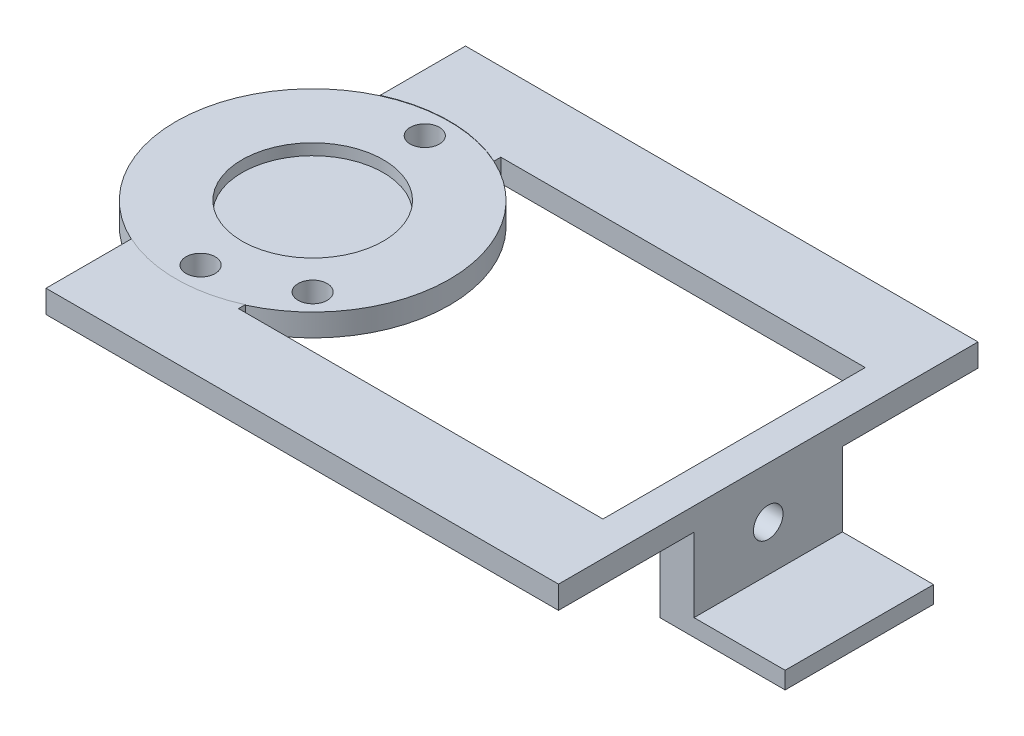
ISO-10303-21;
HEADER;
FILE_DESCRIPTION(('STEP AP214'),'2;1');
FILE_NAME('part.step','',(''),(''),'','','');
FILE_SCHEMA(('AUTOMOTIVE_DESIGN { 1 0 10303 214 1 1 1 1 }'));
ENDSEC;
DATA;
#1=APPLICATION_CONTEXT('core data for automotive mechanical design processes');
#2=APPLICATION_PROTOCOL_DEFINITION('international standard','automotive_design',2000,#1);
#3=PRODUCT_CONTEXT('',#1,'mechanical');
#4=PRODUCT('Part','Part','',(#3));
#5=PRODUCT_RELATED_PRODUCT_CATEGORY('part','',(#4));
#6=PRODUCT_DEFINITION_FORMATION('','',#4);
#7=PRODUCT_DEFINITION_CONTEXT('part definition',#1,'design');
#8=PRODUCT_DEFINITION('design','',#6,#7);
#9=PRODUCT_DEFINITION_SHAPE('','',#8);
#10=(LENGTH_UNIT() NAMED_UNIT(*) SI_UNIT(.MILLI.,.METRE.));
#11=(NAMED_UNIT(*) PLANE_ANGLE_UNIT() SI_UNIT($,.RADIAN.));
#12=(NAMED_UNIT(*) SI_UNIT($,.STERADIAN.) SOLID_ANGLE_UNIT());
#13=UNCERTAINTY_MEASURE_WITH_UNIT(LENGTH_MEASURE(1.E-05),#10,'distance_accuracy_value','');
#14=(GEOMETRIC_REPRESENTATION_CONTEXT(3) GLOBAL_UNCERTAINTY_ASSIGNED_CONTEXT((#13)) GLOBAL_UNIT_ASSIGNED_CONTEXT((#10,
#11,#12)) REPRESENTATION_CONTEXT('',''));
#15=CARTESIAN_POINT('',(0.,0.,0.));
#16=DIRECTION('',(0.,0.,1.));
#17=DIRECTION('',(1.,0.,0.));
#18=AXIS2_PLACEMENT_3D('',#15,#16,#17);
#19=CARTESIAN_POINT('',(101.6,-6.35,0.));
#20=DIRECTION('',(-1.,0.,0.));
#21=DIRECTION('',(0.,0.,1.));
#22=AXIS2_PLACEMENT_3D('',#19,#20,#21);
#23=CYLINDRICAL_SURFACE('',#22,3.302);
#24=CARTESIAN_POINT('',(101.6,-6.35,0.));
#25=DIRECTION('',(-1.,0.,0.));
#26=DIRECTION('',(0.,0.,1.));
#27=AXIS2_PLACEMENT_3D('',#24,#25,#26);
#28=CIRCLE('',#27,3.302);
#29=CARTESIAN_POINT('',(101.6,-6.35,3.30200000000001));
#30=VERTEX_POINT('',#29);
#31=EDGE_CURVE('E485',#30,#30,#28,.T.);
#32=CARTESIAN_POINT('',(96.52,-6.35,0.));
#33=DIRECTION('',(-1.,0.,0.));
#34=DIRECTION('',(0.,0.,1.));
#35=AXIS2_PLACEMENT_3D('',#32,#33,#34);
#36=CIRCLE('',#35,3.302);
#37=CARTESIAN_POINT('',(96.52,-6.35,3.30200000000001));
#38=VERTEX_POINT('',#37);
#39=EDGE_CURVE('E48',#38,#38,#36,.F.);
#40=CARTESIAN_POINT('',(101.6,-6.35,3.30200000000001));
#41=CARTESIAN_POINT('',(101.547083333333,-6.35,3.30200000000001));
#42=CARTESIAN_POINT('',(101.494166666667,-6.35,3.30200000000001));
#43=CARTESIAN_POINT('',(101.388333333333,-6.35,3.30200000000001));
#44=CARTESIAN_POINT('',(101.335416666667,-6.35,3.30200000000001));
#45=CARTESIAN_POINT('',(101.229583333333,-6.35,3.30200000000001));
#46=CARTESIAN_POINT('',(101.176666666667,-6.35,3.30200000000001));
#47=CARTESIAN_POINT('',(101.070833333333,-6.35,3.30200000000001));
#48=CARTESIAN_POINT('',(101.017916666667,-6.35,3.30200000000001));
#49=CARTESIAN_POINT('',(100.912083333333,-6.35,3.30200000000001));
#50=CARTESIAN_POINT('',(100.859166666667,-6.35,3.30200000000001));
#51=CARTESIAN_POINT('',(100.753333333333,-6.35,3.30200000000001));
#52=CARTESIAN_POINT('',(100.700416666667,-6.35,3.30200000000001));
#53=CARTESIAN_POINT('',(100.594583333333,-6.35,3.30200000000001));
#54=CARTESIAN_POINT('',(100.541666666667,-6.35,3.30200000000001));
#55=CARTESIAN_POINT('',(100.435833333333,-6.35,3.30200000000001));
#56=CARTESIAN_POINT('',(100.382916666667,-6.35,3.30200000000001));
#57=CARTESIAN_POINT('',(100.277083333333,-6.35,3.30200000000001));
#58=CARTESIAN_POINT('',(100.224166666667,-6.35,3.30200000000001));
#59=CARTESIAN_POINT('',(100.118333333333,-6.35,3.30200000000001));
#60=CARTESIAN_POINT('',(100.065416666667,-6.35,3.30200000000001));
#61=CARTESIAN_POINT('',(99.9595833333333,-6.35,3.30200000000001));
#62=CARTESIAN_POINT('',(99.9066666666667,-6.35,3.30200000000001));
#63=CARTESIAN_POINT('',(99.8008333333333,-6.35,3.30200000000001));
#64=CARTESIAN_POINT('',(99.7479166666667,-6.35,3.30200000000001));
#65=CARTESIAN_POINT('',(99.6420833333333,-6.35,3.30200000000001));
#66=CARTESIAN_POINT('',(99.5891666666667,-6.35,3.30200000000001));
#67=CARTESIAN_POINT('',(99.4833333333333,-6.35,3.30200000000001));
#68=CARTESIAN_POINT('',(99.4304166666667,-6.35,3.30200000000001));
#69=CARTESIAN_POINT('',(99.3245833333333,-6.35,3.30200000000001));
#70=CARTESIAN_POINT('',(99.2716666666667,-6.35,3.30200000000001));
#71=CARTESIAN_POINT('',(99.1658333333333,-6.35,3.30200000000001));
#72=CARTESIAN_POINT('',(99.1129166666667,-6.35,3.30200000000001));
#73=CARTESIAN_POINT('',(99.0070833333333,-6.35,3.30200000000001));
#74=CARTESIAN_POINT('',(98.9541666666667,-6.35,3.30200000000001));
#75=CARTESIAN_POINT('',(98.8483333333333,-6.35,3.30200000000001));
#76=CARTESIAN_POINT('',(98.7954166666667,-6.35,3.30200000000001));
#77=CARTESIAN_POINT('',(98.6895833333333,-6.35,3.30200000000001));
#78=CARTESIAN_POINT('',(98.6366666666667,-6.35,3.30200000000001));
#79=CARTESIAN_POINT('',(98.5308333333333,-6.35,3.30200000000001));
#80=CARTESIAN_POINT('',(98.4779166666667,-6.35,3.30200000000001));
#81=CARTESIAN_POINT('',(98.3720833333333,-6.35,3.30200000000001));
#82=CARTESIAN_POINT('',(98.3191666666666,-6.35,3.30200000000001));
#83=CARTESIAN_POINT('',(98.2133333333333,-6.35,3.30200000000001));
#84=CARTESIAN_POINT('',(98.1604166666666,-6.35,3.30200000000001));
#85=CARTESIAN_POINT('',(98.0545833333333,-6.35,3.30200000000001));
#86=CARTESIAN_POINT('',(98.0016666666667,-6.35,3.30200000000001));
#87=CARTESIAN_POINT('',(97.8958333333333,-6.35,3.30200000000001));
#88=CARTESIAN_POINT('',(97.8429166666667,-6.35,3.30200000000001));
#89=CARTESIAN_POINT('',(97.7370833333333,-6.35,3.30200000000001));
#90=CARTESIAN_POINT('',(97.6841666666667,-6.35,3.30200000000001));
#91=CARTESIAN_POINT('',(97.5783333333333,-6.35,3.30200000000001));
#92=CARTESIAN_POINT('',(97.5254166666667,-6.35,3.30200000000001));
#93=CARTESIAN_POINT('',(97.4195833333333,-6.35,3.30200000000001));
#94=CARTESIAN_POINT('',(97.3666666666667,-6.35,3.30200000000001));
#95=CARTESIAN_POINT('',(97.2608333333333,-6.35,3.30200000000001));
#96=CARTESIAN_POINT('',(97.2079166666667,-6.35,3.30200000000001));
#97=CARTESIAN_POINT('',(97.1020833333333,-6.35,3.30200000000001));
#98=CARTESIAN_POINT('',(97.0491666666667,-6.35,3.30200000000001));
#99=CARTESIAN_POINT('',(96.9433333333333,-6.35,3.30200000000001));
#100=CARTESIAN_POINT('',(96.8904166666667,-6.35,3.30200000000001));
#101=CARTESIAN_POINT('',(96.7845833333333,-6.35,3.30200000000001));
#102=CARTESIAN_POINT('',(96.7316666666667,-6.35,3.30200000000001));
#103=CARTESIAN_POINT('',(96.6258333333333,-6.35,3.30200000000001));
#104=CARTESIAN_POINT('',(96.5729166666666,-6.35,3.30200000000001));
#105=CARTESIAN_POINT('',(96.52,-6.35,3.30200000000001));
#106=B_SPLINE_CURVE_WITH_KNOTS('',3,(#40,#41,#42,#43,#44,#45,#46,#47,#48,#49,#50,#51,#52,#53,
#54,#55,#56,#57,#58,#59,#60,#61,#62,#63,#64,#65,#66,#67,#68,#69,#70,#71,#72,#73,#74,#75,#76,#77,
#78,#79,#80,#81,#82,#83,#84,#85,#86,#87,#88,#89,#90,#91,#92,#93,#94,#95,#96,#97,#98,#99,#100,
#101,#102,#103,#104,#105),.UNSPECIFIED.,.F.,.F.,(4,2,2,2,2,2,2,2,2,2,2,2,2,2,2,2,2,2,2,2,2,2,2,
2,2,2,2,2,2,2,2,2,4),(0.,0.158750000000013,0.317500000000012,0.476250000000011,
0.635000000000011,0.79375000000001,0.952500000000009,1.11125000000001,1.27000000000001,
1.42875000000001,1.58750000000001,1.74625000000002,1.90500000000002,2.06375000000002,
2.22250000000002,2.38125000000002,2.54000000000001,2.69875000000001,2.85750000000001,
3.01625000000001,3.17500000000001,3.33375000000002,3.49250000000002,3.65125000000002,
3.81000000000002,3.96875000000002,4.12750000000002,4.28625000000002,4.44500000000002,
4.60375000000002,4.76250000000002,4.92125000000002,5.08000000000003),.UNSPECIFIED.);
#107=EDGE_CURVE('BSEAM44',#30,#38,#106,.T.);
#108=ORIENTED_EDGE('',*,*,#31,.F.);
#109=ORIENTED_EDGE('',*,*,#39,.F.);
#110=ORIENTED_EDGE('',*,*,#107,.T.);
#111=ORIENTED_EDGE('',*,*,#107,.F.);
#112=EDGE_LOOP('',(#108,#110,#109,#111));
#113=FACE_BOUND('',#112,.T.);
#114=ADVANCED_FACE('F44',(#113),#23,.F.);
#115=CARTESIAN_POINT('',(0.,0.,0.));
#116=DIRECTION('',(0.,1.,0.));
#117=DIRECTION('',(0.,0.,1.));
#118=AXIS2_PLACEMENT_3D('',#115,#116,#117);
#119=PLANE('',#118);
#120=CARTESIAN_POINT('',(0.,0.,0.));
#121=DIRECTION('',(0.,-1.,0.));
#122=DIRECTION('',(0.,0.,-1.));
#123=AXIS2_PLACEMENT_3D('',#120,#121,#122);
#124=CIRCLE('',#123,15.75);
#125=CARTESIAN_POINT('',(0.,0.,-15.75));
#126=VERTEX_POINT('',#125);
#127=EDGE_CURVE('E12',#126,#126,#124,.T.);
#128=ORIENTED_EDGE('',*,*,#127,.F.);
#129=EDGE_LOOP('',(#128));
#130=FACE_BOUND('',#129,.T.);
#131=CARTESIAN_POINT('',(0.,0.,-25.));
#132=DIRECTION('',(0.,-1.,0.));
#133=DIRECTION('',(0.,0.,-1.));
#134=AXIS2_PLACEMENT_3D('',#131,#132,#133);
#135=CIRCLE('',#134,3.25);
#136=CARTESIAN_POINT('',(0.,0.,-28.25));
#137=VERTEX_POINT('',#136);
#138=EDGE_CURVE('E337',#137,#137,#135,.T.);
#139=ORIENTED_EDGE('',*,*,#138,.F.);
#140=EDGE_LOOP('',(#139));
#141=FACE_BOUND('',#140,.T.);
#142=CARTESIAN_POINT('',(0.,0.,25.));
#143=DIRECTION('',(0.,-1.,0.));
#144=DIRECTION('',(0.,0.,-1.));
#145=AXIS2_PLACEMENT_3D('',#142,#143,#144);
#146=CIRCLE('',#145,3.25);
#147=CARTESIAN_POINT('',(0.,0.,21.75));
#148=VERTEX_POINT('',#147);
#149=EDGE_CURVE('E331',#148,#148,#146,.T.);
#150=ORIENTED_EDGE('',*,*,#149,.F.);
#151=EDGE_LOOP('',(#150));
#152=FACE_BOUND('',#151,.T.);
#153=CARTESIAN_POINT('',(17.6744764826842,0.,17.680862));
#154=DIRECTION('',(0.,-1.,0.));
#155=DIRECTION('',(0.,0.,-1.));
#156=AXIS2_PLACEMENT_3D('',#153,#154,#155);
#157=CIRCLE('',#156,3.25);
#158=CARTESIAN_POINT('',(17.6744764826842,0.,14.430862));
#159=VERTEX_POINT('',#158);
#160=EDGE_CURVE('E325',#159,#159,#157,.T.);
#161=ORIENTED_EDGE('',*,*,#160,.F.);
#162=EDGE_LOOP('',(#161));
#163=FACE_BOUND('',#162,.T.);
#164=DIRECTION('',(1.,0.,0.));
#165=VECTOR('',#164,1.);
#166=CARTESIAN_POINT('',(93.98,0.,-16.5541280198992));
#167=LINE('',#166,#165);
#168=CARTESIAN_POINT('',(93.98,0.,-16.5541280198992));
#169=VERTEX_POINT('',#168);
#170=CARTESIAN_POINT('',(101.6,0.,-16.5541280198992));
#171=VERTEX_POINT('',#170);
#172=EDGE_CURVE('E202',#169,#171,#167,.T.);
#173=ORIENTED_EDGE('',*,*,#172,.F.);
#174=DIRECTION('',(0.,0.,1.));
#175=VECTOR('',#174,1.);
#176=CARTESIAN_POINT('',(93.98,0.,-34.2458719801008));
#177=LINE('',#176,#175);
#178=CARTESIAN_POINT('',(93.98,0.,-29.2541280198992));
#179=VERTEX_POINT('',#178);
#180=EDGE_CURVE('E241',#179,#169,#177,.T.);
#181=ORIENTED_EDGE('',*,*,#180,.F.);
#182=DIRECTION('',(-1.,0.,0.));
#183=VECTOR('',#182,1.);
#184=CARTESIAN_POINT('',(119.38,0.,-29.2541280198992));
#185=LINE('',#184,#183);
#186=CARTESIAN_POINT('',(12.7,0.,-29.2541280198992));
#187=VERTEX_POINT('',#186);
#188=EDGE_CURVE('E257',#179,#187,#185,.T.);
#189=ORIENTED_EDGE('',*,*,#188,.T.);
#190=DIRECTION('',(0.,0.,-1.));
#191=VECTOR('',#190,1.);
#192=CARTESIAN_POINT('',(12.7,0.,0.));
#193=LINE('',#192,#191);
#194=CARTESIAN_POINT('',(12.7,0.,-27.7301280198992));
#195=VERTEX_POINT('',#194);
#196=EDGE_CURVE('E261',#195,#187,#193,.T.);
#197=ORIENTED_EDGE('',*,*,#196,.F.);
#198=CARTESIAN_POINT('',(0.,0.,0.));
#199=DIRECTION('',(0.,1.,0.));
#200=DIRECTION('',(0.,0.,1.));
#201=AXIS2_PLACEMENT_3D('',#198,#199,#200);
#202=CIRCLE('',#201,30.5);
#203=CARTESIAN_POINT('',(12.7,0.,27.7301280198992));
#204=VERTEX_POINT('',#203);
#205=EDGE_CURVE('E355',#204,#195,#202,.T.);
#206=ORIENTED_EDGE('',*,*,#205,.F.);
#207=DIRECTION('',(0.,0.,1.));
#208=VECTOR('',#207,1.);
#209=CARTESIAN_POINT('',(12.7,0.,0.));
#210=LINE('',#209,#208);
#211=CARTESIAN_POINT('',(12.7,0.,29.2541280198992));
#212=VERTEX_POINT('',#211);
#213=EDGE_CURVE('E309',#204,#212,#210,.T.);
#214=ORIENTED_EDGE('',*,*,#213,.T.);
#215=DIRECTION('',(-1.,0.,0.));
#216=VECTOR('',#215,1.);
#217=CARTESIAN_POINT('',(119.38,0.,29.2541280198992));
#218=LINE('',#217,#216);
#219=CARTESIAN_POINT('',(93.98,0.,29.2541280198992));
#220=VERTEX_POINT('',#219);
#221=EDGE_CURVE('E252',#220,#212,#218,.T.);
#222=ORIENTED_EDGE('',*,*,#221,.F.);
#223=CARTESIAN_POINT('',(93.98,0.,16.5541280198992));
#224=VERTEX_POINT('',#223);
#225=EDGE_CURVE('E240',#224,#220,#177,.T.);
#226=ORIENTED_EDGE('',*,*,#225,.F.);
#227=DIRECTION('',(-1.,0.,0.));
#228=VECTOR('',#227,1.);
#229=CARTESIAN_POINT('',(93.98,0.,16.5541280198992));
#230=LINE('',#229,#228);
#231=CARTESIAN_POINT('',(101.6,0.,16.5541280198992));
#232=VERTEX_POINT('',#231);
#233=EDGE_CURVE('E204',#232,#224,#230,.T.);
#234=ORIENTED_EDGE('',*,*,#233,.F.);
#235=DIRECTION('',(0.,0.,-1.));
#236=VECTOR('',#235,1.);
#237=CARTESIAN_POINT('',(101.6,0.,-46.7801280198992));
#238=LINE('',#237,#236);
#239=CARTESIAN_POINT('',(101.6,0.,46.7801280198992));
#240=VERTEX_POINT('',#239);
#241=EDGE_CURVE('E232',#240,#232,#238,.T.);
#242=ORIENTED_EDGE('',*,*,#241,.F.);
#243=DIRECTION('',(-1.,0.,0.));
#244=VECTOR('',#243,1.);
#245=CARTESIAN_POINT('',(0.,0.,46.7801280198992));
#246=LINE('',#245,#244);
#247=CARTESIAN_POINT('',(-12.7,0.,46.7801280198992));
#248=VERTEX_POINT('',#247);
#249=EDGE_CURVE('E299',#240,#248,#246,.T.);
#250=ORIENTED_EDGE('',*,*,#249,.T.);
#251=DIRECTION('',(0.,0.,1.));
#252=VECTOR('',#251,1.);
#253=CARTESIAN_POINT('',(-12.7,0.,0.));
#254=LINE('',#253,#252);
#255=CARTESIAN_POINT('',(-12.7,0.,27.7301280198992));
#256=VERTEX_POINT('',#255);
#257=EDGE_CURVE('E294',#256,#248,#254,.T.);
#258=ORIENTED_EDGE('',*,*,#257,.F.);
#259=CARTESIAN_POINT('',(-12.7,0.,-27.7301280198992));
#260=VERTEX_POINT('',#259);
#261=EDGE_CURVE('E350',#260,#256,#202,.T.);
#262=ORIENTED_EDGE('',*,*,#261,.F.);
#263=DIRECTION('',(0.,0.,-1.));
#264=VECTOR('',#263,1.);
#265=CARTESIAN_POINT('',(-12.7,0.,0.));
#266=LINE('',#265,#264);
#267=CARTESIAN_POINT('',(-12.7,0.,-46.7801280198992));
#268=VERTEX_POINT('',#267);
#269=EDGE_CURVE('E277',#260,#268,#266,.T.);
#270=ORIENTED_EDGE('',*,*,#269,.T.);
#271=DIRECTION('',(1.,0.,0.));
#272=VECTOR('',#271,1.);
#273=CARTESIAN_POINT('',(0.,0.,-46.7801280198992));
#274=LINE('',#273,#272);
#275=CARTESIAN_POINT('',(101.6,0.,-46.7801280198992));
#276=VERTEX_POINT('',#275);
#277=EDGE_CURVE('E266',#268,#276,#274,.T.);
#278=ORIENTED_EDGE('',*,*,#277,.T.);
#279=EDGE_CURVE('E231',#171,#276,#238,.T.);
#280=ORIENTED_EDGE('',*,*,#279,.F.);
#281=EDGE_LOOP('',(#173,#181,#189,#197,#206,#214,#222,#226,#234,#242,#250,#258,#262,#270,#278,#280));
#282=FACE_BOUND('',#281,.T.);
#283=ADVANCED_FACE('F374',(#130,#141,#152,#163,#282),#119,.F.);
#284=CARTESIAN_POINT('',(0.,5.08,46.7801280198992));
#285=DIRECTION('',(0.,0.,1.));
#286=DIRECTION('',(1.,0.,0.));
#287=AXIS2_PLACEMENT_3D('',#284,#285,#286);
#288=PLANE('',#287);
#289=ORIENTED_EDGE('',*,*,#249,.F.);
#290=DIRECTION('',(0.,-1.,0.));
#291=VECTOR('',#290,1.);
#292=CARTESIAN_POINT('',(101.6,0.,46.7801280198992));
#293=LINE('',#292,#291);
#294=CARTESIAN_POINT('',(101.6,5.08,46.7801280198992));
#295=VERTEX_POINT('',#294);
#296=EDGE_CURVE('E229',#295,#240,#293,.T.);
#297=ORIENTED_EDGE('',*,*,#296,.F.);
#298=DIRECTION('',(-1.,0.,0.));
#299=VECTOR('',#298,1.);
#300=CARTESIAN_POINT('',(0.,5.08,46.7801280198992));
#301=LINE('',#300,#299);
#302=CARTESIAN_POINT('',(-12.7,5.08,46.7801280198992));
#303=VERTEX_POINT('',#302);
#304=EDGE_CURVE('E304',#295,#303,#301,.T.);
#305=ORIENTED_EDGE('',*,*,#304,.T.);
#306=DIRECTION('',(0.,-1.,0.));
#307=VECTOR('',#306,1.);
#308=CARTESIAN_POINT('',(-12.7,5.08,46.7801280198992));
#309=LINE('',#308,#307);
#310=EDGE_CURVE('E313',#303,#248,#309,.T.);
#311=ORIENTED_EDGE('',*,*,#310,.T.);
#312=EDGE_LOOP('',(#289,#297,#305,#311));
#313=FACE_BOUND('',#312,.T.);
#314=ADVANCED_FACE('F380',(#313),#288,.T.);
#315=CARTESIAN_POINT('',(0.,5.08,0.));
#316=DIRECTION('',(0.,-1.,0.));
#317=DIRECTION('',(0.,0.,-1.));
#318=AXIS2_PLACEMENT_3D('',#315,#316,#317);
#319=PLANE('',#318);
#320=DIRECTION('',(0.,0.,1.));
#321=VECTOR('',#320,1.);
#322=CARTESIAN_POINT('',(101.6,5.08,-46.7801280198992));
#323=LINE('',#322,#321);
#324=CARTESIAN_POINT('',(101.6,5.08,-46.7801280198992));
#325=VERTEX_POINT('',#324);
#326=EDGE_CURVE('E227',#325,#295,#323,.T.);
#327=ORIENTED_EDGE('',*,*,#326,.F.);
#328=DIRECTION('',(1.,0.,0.));
#329=VECTOR('',#328,1.);
#330=CARTESIAN_POINT('',(0.,5.08,-46.7801280198992));
#331=LINE('',#330,#329);
#332=CARTESIAN_POINT('',(-12.7,5.08,-46.7801280198992));
#333=VERTEX_POINT('',#332);
#334=EDGE_CURVE('E271',#333,#325,#331,.T.);
#335=ORIENTED_EDGE('',*,*,#334,.F.);
#336=DIRECTION('',(0.,0.,-1.));
#337=VECTOR('',#336,1.);
#338=CARTESIAN_POINT('',(-12.7,5.08,0.));
#339=LINE('',#338,#337);
#340=CARTESIAN_POINT('',(-12.7,5.08,-27.7301280198992));
#341=VERTEX_POINT('',#340);
#342=EDGE_CURVE('E268',#341,#333,#339,.T.);
#343=ORIENTED_EDGE('',*,*,#342,.F.);
#344=CARTESIAN_POINT('',(0.,5.08,0.));
#345=DIRECTION('',(0.,-1.,0.));
#346=DIRECTION('',(0.,0.,-1.));
#347=AXIS2_PLACEMENT_3D('',#344,#345,#346);
#348=CIRCLE('',#347,30.5);
#349=CARTESIAN_POINT('',(12.7,5.08,-27.7301280198992));
#350=VERTEX_POINT('',#349);
#351=EDGE_CURVE('E265',#341,#350,#348,.T.);
#352=ORIENTED_EDGE('',*,*,#351,.T.);
#353=DIRECTION('',(0.,0.,-1.));
#354=VECTOR('',#353,1.);
#355=CARTESIAN_POINT('',(12.7,5.08,0.));
#356=LINE('',#355,#354);
#357=CARTESIAN_POINT('',(12.7,5.08,-29.2541280198992));
#358=VERTEX_POINT('',#357);
#359=EDGE_CURVE('E262',#350,#358,#356,.T.);
#360=ORIENTED_EDGE('',*,*,#359,.T.);
#361=DIRECTION('',(-1.,0.,0.));
#362=VECTOR('',#361,1.);
#363=CARTESIAN_POINT('',(119.38,5.08,-29.2541280198992));
#364=LINE('',#363,#362);
#365=CARTESIAN_POINT('',(93.98,5.08,-29.2541280198992));
#366=VERTEX_POINT('',#365);
#367=EDGE_CURVE('E259',#366,#358,#364,.T.);
#368=ORIENTED_EDGE('',*,*,#367,.F.);
#369=DIRECTION('',(0.,0.,1.));
#370=VECTOR('',#369,1.);
#371=CARTESIAN_POINT('',(93.98,5.08,-34.2458719801008));
#372=LINE('',#371,#370);
#373=CARTESIAN_POINT('',(93.98,5.08,29.2541280198992));
#374=VERTEX_POINT('',#373);
#375=EDGE_CURVE('E238',#366,#374,#372,.T.);
#376=ORIENTED_EDGE('',*,*,#375,.T.);
#377=DIRECTION('',(-1.,0.,0.));
#378=VECTOR('',#377,1.);
#379=CARTESIAN_POINT('',(119.38,5.08,29.2541280198992));
#380=LINE('',#379,#378);
#381=CARTESIAN_POINT('',(12.7,5.08,29.2541280198992));
#382=VERTEX_POINT('',#381);
#383=EDGE_CURVE('E250',#374,#382,#380,.T.);
#384=ORIENTED_EDGE('',*,*,#383,.T.);
#385=DIRECTION('',(0.,0.,1.));
#386=VECTOR('',#385,1.);
#387=CARTESIAN_POINT('',(12.7,5.08,0.));
#388=LINE('',#387,#386);
#389=CARTESIAN_POINT('',(12.7,5.08,27.7301280198992));
#390=VERTEX_POINT('',#389);
#391=EDGE_CURVE('E301',#390,#382,#388,.T.);
#392=ORIENTED_EDGE('',*,*,#391,.F.);
#393=CARTESIAN_POINT('',(0.,5.08,0.));
#394=DIRECTION('',(0.,-1.,0.));
#395=DIRECTION('',(0.,0.,-1.));
#396=AXIS2_PLACEMENT_3D('',#393,#394,#395);
#397=CIRCLE('',#396,30.5);
#398=CARTESIAN_POINT('',(-12.7,5.08,27.7301280198992));
#399=VERTEX_POINT('',#398);
#400=EDGE_CURVE('E298',#390,#399,#397,.T.);
#401=ORIENTED_EDGE('',*,*,#400,.T.);
#402=DIRECTION('',(0.,0.,1.));
#403=VECTOR('',#402,1.);
#404=CARTESIAN_POINT('',(-12.7,5.08,0.));
#405=LINE('',#404,#403);
#406=EDGE_CURVE('E295',#399,#303,#405,.T.);
#407=ORIENTED_EDGE('',*,*,#406,.T.);
#408=ORIENTED_EDGE('',*,*,#304,.F.);
#409=EDGE_LOOP('',(#327,#335,#343,#352,#360,#368,#376,#384,#392,#401,#407,#408));
#410=FACE_BOUND('',#409,.T.);
#411=ADVANCED_FACE('F384',(#410),#319,.F.);
#412=CARTESIAN_POINT('',(0.,5.08,-46.7801280198992));
#413=DIRECTION('',(0.,0.,-1.));
#414=DIRECTION('',(-1.,0.,0.));
#415=AXIS2_PLACEMENT_3D('',#412,#413,#414);
#416=PLANE('',#415);
#417=ORIENTED_EDGE('',*,*,#334,.T.);
#418=DIRECTION('',(0.,1.,0.));
#419=VECTOR('',#418,1.);
#420=CARTESIAN_POINT('',(101.6,0.,-46.7801280198992));
#421=LINE('',#420,#419);
#422=EDGE_CURVE('E225',#276,#325,#421,.T.);
#423=ORIENTED_EDGE('',*,*,#422,.F.);
#424=ORIENTED_EDGE('',*,*,#277,.F.);
#425=DIRECTION('',(0.,-1.,0.));
#426=VECTOR('',#425,1.);
#427=CARTESIAN_POINT('',(-12.7,5.08,-46.7801280198992));
#428=LINE('',#427,#426);
#429=EDGE_CURVE('E282',#333,#268,#428,.T.);
#430=ORIENTED_EDGE('',*,*,#429,.F.);
#431=EDGE_LOOP('',(#417,#423,#424,#430));
#432=FACE_BOUND('',#431,.T.);
#433=ADVANCED_FACE('F418',(#432),#416,.T.);
#434=CARTESIAN_POINT('',(119.38,0.,-29.2541280198992));
#435=DIRECTION('',(0.,0.,-1.));
#436=DIRECTION('',(-1.,0.,0.));
#437=AXIS2_PLACEMENT_3D('',#434,#435,#436);
#438=PLANE('',#437);
#439=DIRECTION('',(0.,-1.,0.));
#440=VECTOR('',#439,1.);
#441=CARTESIAN_POINT('',(93.98,0.,-29.2541280198992));
#442=LINE('',#441,#440);
#443=EDGE_CURVE('E244',#366,#179,#442,.T.);
#444=ORIENTED_EDGE('',*,*,#443,.F.);
#445=ORIENTED_EDGE('',*,*,#367,.T.);
#446=DIRECTION('',(0.,-1.,0.));
#447=VECTOR('',#446,1.);
#448=CARTESIAN_POINT('',(12.7,0.,-29.2541280198992));
#449=LINE('',#448,#447);
#450=EDGE_CURVE('E254',#358,#187,#449,.T.);
#451=ORIENTED_EDGE('',*,*,#450,.T.);
#452=ORIENTED_EDGE('',*,*,#188,.F.);
#453=EDGE_LOOP('',(#444,#445,#451,#452));
#454=FACE_BOUND('',#453,.T.);
#455=ADVANCED_FACE('F424',(#454),#438,.F.);
#456=CARTESIAN_POINT('',(119.38,0.,29.2541280198992));
#457=DIRECTION('',(0.,0.,1.));
#458=DIRECTION('',(1.,0.,0.));
#459=AXIS2_PLACEMENT_3D('',#456,#457,#458);
#460=PLANE('',#459);
#461=DIRECTION('',(0.,1.,0.));
#462=VECTOR('',#461,1.);
#463=CARTESIAN_POINT('',(93.98,0.,29.2541280198992));
#464=LINE('',#463,#462);
#465=EDGE_CURVE('E235',#220,#374,#464,.T.);
#466=ORIENTED_EDGE('',*,*,#465,.F.);
#467=ORIENTED_EDGE('',*,*,#221,.T.);
#468=DIRECTION('',(0.,1.,0.));
#469=VECTOR('',#468,1.);
#470=CARTESIAN_POINT('',(12.7,0.,29.2541280198992));
#471=LINE('',#470,#469);
#472=EDGE_CURVE('E247',#212,#382,#471,.T.);
#473=ORIENTED_EDGE('',*,*,#472,.T.);
#474=ORIENTED_EDGE('',*,*,#383,.F.);
#475=EDGE_LOOP('',(#466,#467,#473,#474));
#476=FACE_BOUND('',#475,.T.);
#477=ADVANCED_FACE('F430',(#476),#460,.F.);
#478=CARTESIAN_POINT('',(12.7,5.08,0.));
#479=DIRECTION('',(1.,0.,0.));
#480=DIRECTION('',(0.,0.,-1.));
#481=AXIS2_PLACEMENT_3D('',#478,#479,#480);
#482=PLANE('',#481);
#483=ORIENTED_EDGE('',*,*,#391,.T.);
#484=ORIENTED_EDGE('',*,*,#472,.F.);
#485=ORIENTED_EDGE('',*,*,#213,.F.);
#486=DIRECTION('',(0.,-1.,0.));
#487=VECTOR('',#486,1.);
#488=CARTESIAN_POINT('',(12.7,5.08,27.7301280198992));
#489=LINE('',#488,#487);
#490=CARTESIAN_POINT('',(12.7,5.,27.7301280198992));
#491=VERTEX_POINT('',#490);
#492=EDGE_CURVE('E320',#491,#204,#489,.T.);
#493=ORIENTED_EDGE('',*,*,#492,.F.);
#494=EDGE_CURVE('E317',#390,#491,#489,.T.);
#495=ORIENTED_EDGE('',*,*,#494,.F.);
#496=EDGE_LOOP('',(#483,#484,#485,#493,#495));
#497=FACE_BOUND('',#496,.T.);
#498=ADVANCED_FACE('F397',(#497),#482,.T.);
#499=CARTESIAN_POINT('',(12.7,5.08,0.));
#500=DIRECTION('',(-1.,0.,0.));
#501=DIRECTION('',(0.,0.,1.));
#502=AXIS2_PLACEMENT_3D('',#499,#500,#501);
#503=PLANE('',#502);
#504=ORIENTED_EDGE('',*,*,#450,.F.);
#505=ORIENTED_EDGE('',*,*,#359,.F.);
#506=DIRECTION('',(0.,-1.,0.));
#507=VECTOR('',#506,1.);
#508=CARTESIAN_POINT('',(12.7,5.08,-27.7301280198992));
#509=LINE('',#508,#507);
#510=CARTESIAN_POINT('',(12.7,5.,-27.7301280198992));
#511=VERTEX_POINT('',#510);
#512=EDGE_CURVE('E289',#350,#511,#509,.T.);
#513=ORIENTED_EDGE('',*,*,#512,.T.);
#514=EDGE_CURVE('E274',#511,#195,#509,.T.);
#515=ORIENTED_EDGE('',*,*,#514,.T.);
#516=ORIENTED_EDGE('',*,*,#196,.T.);
#517=EDGE_LOOP('',(#504,#505,#513,#515,#516));
#518=FACE_BOUND('',#517,.T.);
#519=ADVANCED_FACE('F405',(#518),#503,.F.);
#520=CARTESIAN_POINT('',(0.,5.,0.));
#521=DIRECTION('',(0.,-1.,0.));
#522=DIRECTION('',(0.,0.,-1.));
#523=AXIS2_PLACEMENT_3D('',#520,#521,#522);
#524=CYLINDRICAL_SURFACE('',#523,30.5);
#525=ORIENTED_EDGE('',*,*,#514,.F.);
#526=CARTESIAN_POINT('',(0.,5.,0.));
#527=DIRECTION('',(0.,1.,0.));
#528=DIRECTION('',(0.,0.,1.));
#529=AXIS2_PLACEMENT_3D('',#526,#527,#528);
#530=CIRCLE('',#529,30.5);
#531=EDGE_CURVE('E53',#491,#511,#530,.T.);
#532=ORIENTED_EDGE('',*,*,#531,.F.);
#533=ORIENTED_EDGE('',*,*,#492,.T.);
#534=ORIENTED_EDGE('',*,*,#205,.T.);
#535=EDGE_LOOP('',(#525,#532,#533,#534));
#536=FACE_BOUND('',#535,.T.);
#537=ADVANCED_FACE('F394',(#536),#524,.T.);
#538=CARTESIAN_POINT('',(-12.7,5.,-27.7301280198992));
#539=VERTEX_POINT('',#538);
#540=CARTESIAN_POINT('',(-12.7,5.,27.7301280198992));
#541=VERTEX_POINT('',#540);
#542=EDGE_CURVE('E354',#539,#541,#530,.T.);
#543=ORIENTED_EDGE('',*,*,#542,.F.);
#544=DIRECTION('',(0.,-1.,0.));
#545=VECTOR('',#544,1.);
#546=CARTESIAN_POINT('',(-12.7,5.08,-27.7301280198992));
#547=LINE('',#546,#545);
#548=EDGE_CURVE('E288',#539,#260,#547,.T.);
#549=ORIENTED_EDGE('',*,*,#548,.T.);
#550=ORIENTED_EDGE('',*,*,#261,.T.);
#551=DIRECTION('',(0.,-1.,0.));
#552=VECTOR('',#551,1.);
#553=CARTESIAN_POINT('',(-12.7,5.08,27.7301280198992));
#554=LINE('',#553,#552);
#555=EDGE_CURVE('E306',#541,#256,#554,.T.);
#556=ORIENTED_EDGE('',*,*,#555,.F.);
#557=EDGE_LOOP('',(#543,#549,#550,#556));
#558=FACE_BOUND('',#557,.T.);
#559=ADVANCED_FACE('F46',(#558),#524,.T.);
#560=CARTESIAN_POINT('',(0.,5.,0.));
#561=DIRECTION('',(0.,1.,0.));
#562=DIRECTION('',(0.,0.,1.));
#563=AXIS2_PLACEMENT_3D('',#560,#561,#562);
#564=PLANE('',#563);
#565=CARTESIAN_POINT('',(17.6744764826842,5.,17.680862));
#566=DIRECTION('',(0.,1.,0.));
#567=DIRECTION('',(0.,0.,1.));
#568=AXIS2_PLACEMENT_3D('',#565,#566,#567);
#569=CIRCLE('',#568,3.25);
#570=CARTESIAN_POINT('',(17.6744764826842,5.,20.930862));
#571=VERTEX_POINT('',#570);
#572=EDGE_CURVE('E328',#571,#571,#569,.T.);
#573=ORIENTED_EDGE('',*,*,#572,.F.);
#574=EDGE_LOOP('',(#573));
#575=FACE_BOUND('',#574,.T.);
#576=CARTESIAN_POINT('',(0.,5.,25.));
#577=DIRECTION('',(0.,1.,0.));
#578=DIRECTION('',(0.,0.,1.));
#579=AXIS2_PLACEMENT_3D('',#576,#577,#578);
#580=CIRCLE('',#579,3.25);
#581=CARTESIAN_POINT('',(0.,5.,28.25));
#582=VERTEX_POINT('',#581);
#583=EDGE_CURVE('E334',#582,#582,#580,.T.);
#584=ORIENTED_EDGE('',*,*,#583,.F.);
#585=EDGE_LOOP('',(#584));
#586=FACE_BOUND('',#585,.T.);
#587=CARTESIAN_POINT('',(0.,5.,-25.));
#588=DIRECTION('',(0.,1.,0.));
#589=DIRECTION('',(0.,0.,1.));
#590=AXIS2_PLACEMENT_3D('',#587,#588,#589);
#591=CIRCLE('',#590,3.25);
#592=CARTESIAN_POINT('',(0.,5.,-21.75));
#593=VERTEX_POINT('',#592);
#594=EDGE_CURVE('E340',#593,#593,#591,.T.);
#595=ORIENTED_EDGE('',*,*,#594,.F.);
#596=EDGE_LOOP('',(#595));
#597=FACE_BOUND('',#596,.T.);
#598=CARTESIAN_POINT('',(0.,5.,0.));
#599=DIRECTION('',(0.,1.,0.));
#600=DIRECTION('',(0.,0.,1.));
#601=AXIS2_PLACEMENT_3D('',#598,#599,#600);
#602=CIRCLE('',#601,15.75);
#603=CARTESIAN_POINT('',(0.,5.,15.75));
#604=VERTEX_POINT('',#603);
#605=EDGE_CURVE('E345',#604,#604,#602,.T.);
#606=ORIENTED_EDGE('',*,*,#605,.F.);
#607=EDGE_LOOP('',(#606));
#608=FACE_BOUND('',#607,.T.);
#609=ORIENTED_EDGE('',*,*,#531,.T.);
#610=CARTESIAN_POINT('',(0.,5.,0.));
#611=DIRECTION('',(0.,1.,0.));
#612=DIRECTION('',(0.,0.,1.));
#613=AXIS2_PLACEMENT_3D('',#610,#611,#612);
#614=CIRCLE('',#613,30.5);
#615=EDGE_CURVE('E284',#511,#539,#614,.T.);
#616=ORIENTED_EDGE('',*,*,#615,.T.);
#617=ORIENTED_EDGE('',*,*,#542,.T.);
#618=CARTESIAN_POINT('',(0.,5.,0.));
#619=DIRECTION('',(0.,1.,0.));
#620=DIRECTION('',(0.,0.,1.));
#621=AXIS2_PLACEMENT_3D('',#618,#619,#620);
#622=CIRCLE('',#621,30.5);
#623=EDGE_CURVE('E316',#541,#491,#622,.T.);
#624=ORIENTED_EDGE('',*,*,#623,.T.);
#625=EDGE_LOOP('',(#609,#616,#617,#624));
#626=FACE_BOUND('',#625,.T.);
#627=ADVANCED_FACE('F391',(#575,#586,#597,#608,#626),#564,.T.);
#628=CARTESIAN_POINT('',(0.,2.5,0.));
#629=DIRECTION('',(0.,1.,0.));
#630=DIRECTION('',(0.,0.,1.));
#631=AXIS2_PLACEMENT_3D('',#628,#629,#630);
#632=CYLINDRICAL_SURFACE('',#631,15.75);
#633=CARTESIAN_POINT('',(0.,2.5,0.));
#634=DIRECTION('',(0.,1.,0.));
#635=DIRECTION('',(0.,0.,1.));
#636=AXIS2_PLACEMENT_3D('',#633,#634,#635);
#637=CIRCLE('',#636,15.75);
#638=CARTESIAN_POINT('',(0.,2.5,15.75));
#639=VERTEX_POINT('',#638);
#640=EDGE_CURVE('E347',#639,#639,#637,.T.);
#641=ORIENTED_EDGE('',*,*,#640,.F.);
#642=EDGE_LOOP('',(#641));
#643=FACE_BOUND('',#642,.T.);
#644=ORIENTED_EDGE('',*,*,#605,.T.);
#645=EDGE_LOOP('',(#644));
#646=FACE_BOUND('',#645,.T.);
#647=ADVANCED_FACE('F643',(#643,#646),#632,.F.);
#648=CARTESIAN_POINT('',(0.,2.5,0.));
#649=DIRECTION('',(0.,1.,0.));
#650=DIRECTION('',(0.,0.,1.));
#651=AXIS2_PLACEMENT_3D('',#648,#649,#650);
#652=PLANE('',#651);
#653=ORIENTED_EDGE('',*,*,#640,.T.);
#654=EDGE_LOOP('',(#653));
#655=FACE_BOUND('',#654,.T.);
#656=ADVANCED_FACE('F723',(#655),#652,.T.);
#657=CARTESIAN_POINT('',(0.,-2.5,0.));
#658=DIRECTION('',(0.,1.,0.));
#659=DIRECTION('',(0.,0.,1.));
#660=AXIS2_PLACEMENT_3D('',#657,#658,#659);
#661=CYLINDRICAL_SURFACE('',#660,15.75);
#662=CARTESIAN_POINT('',(0.,-2.5,0.));
#663=DIRECTION('',(0.,-1.,0.));
#664=DIRECTION('',(0.,0.,-1.));
#665=AXIS2_PLACEMENT_3D('',#662,#663,#664);
#666=CIRCLE('',#665,15.75);
#667=CARTESIAN_POINT('',(0.,-2.5,-15.75));
#668=VERTEX_POINT('',#667);
#669=EDGE_CURVE('E343',#668,#668,#666,.T.);
#670=ORIENTED_EDGE('',*,*,#669,.F.);
#671=EDGE_LOOP('',(#670));
#672=FACE_BOUND('',#671,.T.);
#673=ORIENTED_EDGE('',*,*,#127,.T.);
#674=EDGE_LOOP('',(#673));
#675=FACE_BOUND('',#674,.T.);
#676=ADVANCED_FACE('F713',(#672,#675),#661,.T.);
#677=CARTESIAN_POINT('',(0.,-2.5,0.));
#678=DIRECTION('',(0.,-1.,0.));
#679=DIRECTION('',(0.,0.,-1.));
#680=AXIS2_PLACEMENT_3D('',#677,#678,#679);
#681=PLANE('',#680);
#682=ORIENTED_EDGE('',*,*,#669,.T.);
#683=EDGE_LOOP('',(#682));
#684=FACE_BOUND('',#683,.T.);
#685=ADVANCED_FACE('F703',(#684),#681,.T.);
#686=CARTESIAN_POINT('',(0.,5.08,-25.));
#687=DIRECTION('',(0.,-1.,0.));
#688=DIRECTION('',(0.,0.,-1.));
#689=AXIS2_PLACEMENT_3D('',#686,#687,#688);
#690=CYLINDRICAL_SURFACE('',#689,3.25);
#691=ORIENTED_EDGE('',*,*,#594,.T.);
#692=EDGE_LOOP('',(#691));
#693=FACE_BOUND('',#692,.T.);
#694=ORIENTED_EDGE('',*,*,#138,.T.);
#695=EDGE_LOOP('',(#694));
#696=FACE_BOUND('',#695,.T.);
#697=ADVANCED_FACE('F693',(#693,#696),#690,.F.);
#698=CARTESIAN_POINT('',(0.,5.08,25.));
#699=DIRECTION('',(0.,-1.,0.));
#700=DIRECTION('',(0.,0.,-1.));
#701=AXIS2_PLACEMENT_3D('',#698,#699,#700);
#702=CYLINDRICAL_SURFACE('',#701,3.25);
#703=ORIENTED_EDGE('',*,*,#583,.T.);
#704=EDGE_LOOP('',(#703));
#705=FACE_BOUND('',#704,.T.);
#706=ORIENTED_EDGE('',*,*,#149,.T.);
#707=EDGE_LOOP('',(#706));
#708=FACE_BOUND('',#707,.T.);
#709=ADVANCED_FACE('F683',(#705,#708),#702,.F.);
#710=CARTESIAN_POINT('',(17.6744764826842,5.08,17.680862));
#711=DIRECTION('',(0.,-1.,0.));
#712=DIRECTION('',(0.,0.,-1.));
#713=AXIS2_PLACEMENT_3D('',#710,#711,#712);
#714=CYLINDRICAL_SURFACE('',#713,3.25);
#715=ORIENTED_EDGE('',*,*,#572,.T.);
#716=EDGE_LOOP('',(#715));
#717=FACE_BOUND('',#716,.T.);
#718=ORIENTED_EDGE('',*,*,#160,.T.);
#719=EDGE_LOOP('',(#718));
#720=FACE_BOUND('',#719,.T.);
#721=ADVANCED_FACE('F675',(#717,#720),#714,.F.);
#722=CARTESIAN_POINT('',(-12.7,5.08,0.));
#723=DIRECTION('',(1.,0.,0.));
#724=DIRECTION('',(0.,0.,-1.));
#725=AXIS2_PLACEMENT_3D('',#722,#723,#724);
#726=PLANE('',#725);
#727=ORIENTED_EDGE('',*,*,#257,.T.);
#728=ORIENTED_EDGE('',*,*,#310,.F.);
#729=ORIENTED_EDGE('',*,*,#406,.F.);
#730=EDGE_CURVE('E321',#399,#541,#554,.T.);
#731=ORIENTED_EDGE('',*,*,#730,.T.);
#732=ORIENTED_EDGE('',*,*,#555,.T.);
#733=EDGE_LOOP('',(#727,#728,#729,#731,#732));
#734=FACE_BOUND('',#733,.T.);
#735=ADVANCED_FACE('F369',(#734),#726,.F.);
#736=CARTESIAN_POINT('',(0.,5.08,0.));
#737=DIRECTION('',(0.,-1.,0.));
#738=DIRECTION('',(0.,0.,-1.));
#739=AXIS2_PLACEMENT_3D('',#736,#737,#738);
#740=CYLINDRICAL_SURFACE('',#739,30.5);
#741=ORIENTED_EDGE('',*,*,#623,.F.);
#742=ORIENTED_EDGE('',*,*,#730,.F.);
#743=ORIENTED_EDGE('',*,*,#400,.F.);
#744=ORIENTED_EDGE('',*,*,#494,.T.);
#745=EDGE_LOOP('',(#741,#742,#743,#744));
#746=FACE_BOUND('',#745,.T.);
#747=ADVANCED_FACE('F388',(#746),#740,.F.);
#748=CARTESIAN_POINT('',(-12.7,5.08,0.));
#749=DIRECTION('',(-1.,0.,0.));
#750=DIRECTION('',(0.,0.,1.));
#751=AXIS2_PLACEMENT_3D('',#748,#749,#750);
#752=PLANE('',#751);
#753=ORIENTED_EDGE('',*,*,#269,.F.);
#754=ORIENTED_EDGE('',*,*,#548,.F.);
#755=EDGE_CURVE('E285',#341,#539,#547,.T.);
#756=ORIENTED_EDGE('',*,*,#755,.F.);
#757=ORIENTED_EDGE('',*,*,#342,.T.);
#758=ORIENTED_EDGE('',*,*,#429,.T.);
#759=EDGE_LOOP('',(#753,#754,#756,#757,#758));
#760=FACE_BOUND('',#759,.T.);
#761=ADVANCED_FACE('F413',(#760),#752,.T.);
#762=CARTESIAN_POINT('',(0.,5.08,0.));
#763=DIRECTION('',(0.,-1.,0.));
#764=DIRECTION('',(0.,0.,-1.));
#765=AXIS2_PLACEMENT_3D('',#762,#763,#764);
#766=CYLINDRICAL_SURFACE('',#765,30.5);
#767=ORIENTED_EDGE('',*,*,#615,.F.);
#768=ORIENTED_EDGE('',*,*,#512,.F.);
#769=ORIENTED_EDGE('',*,*,#351,.F.);
#770=ORIENTED_EDGE('',*,*,#755,.T.);
#771=EDGE_LOOP('',(#767,#768,#769,#770));
#772=FACE_BOUND('',#771,.T.);
#773=ADVANCED_FACE('F410',(#772),#766,.F.);
#774=CARTESIAN_POINT('',(93.98,0.,-34.2458719801008));
#775=DIRECTION('',(1.,0.,0.));
#776=DIRECTION('',(0.,0.,-1.));
#777=AXIS2_PLACEMENT_3D('',#774,#775,#776);
#778=PLANE('',#777);
#779=CARTESIAN_POINT('',(93.98,-6.35,0.));
#780=DIRECTION('',(-1.,0.,0.));
#781=DIRECTION('',(0.,0.,1.));
#782=AXIS2_PLACEMENT_3D('',#779,#780,#781);
#783=CIRCLE('',#782,4.826);
#784=CARTESIAN_POINT('',(93.98,-6.35,4.82600000000001));
#785=VERTEX_POINT('',#784);
#786=EDGE_CURVE('E478',#785,#785,#783,.T.);
#787=ORIENTED_EDGE('',*,*,#786,.F.);
#788=EDGE_LOOP('',(#787));
#789=FACE_BOUND('',#788,.T.);
#790=ORIENTED_EDGE('',*,*,#375,.F.);
#791=ORIENTED_EDGE('',*,*,#443,.T.);
#792=ORIENTED_EDGE('',*,*,#180,.T.);
#793=DIRECTION('',(0.,1.,0.));
#794=VECTOR('',#793,1.);
#795=CARTESIAN_POINT('',(93.98,-20.32,-16.5541280198992));
#796=LINE('',#795,#794);
#797=CARTESIAN_POINT('',(93.98,-20.32,-16.5541280198992));
#798=VERTEX_POINT('',#797);
#799=EDGE_CURVE('E223',#798,#169,#796,.T.);
#800=ORIENTED_EDGE('',*,*,#799,.F.);
#801=DIRECTION('',(0.,0.,-1.));
#802=VECTOR('',#801,1.);
#803=CARTESIAN_POINT('',(93.98,-20.32,-16.5541280198992));
#804=LINE('',#803,#802);
#805=CARTESIAN_POINT('',(93.98,-20.32,16.5541280198992));
#806=VERTEX_POINT('',#805);
#807=EDGE_CURVE('E209',#806,#798,#804,.T.);
#808=ORIENTED_EDGE('',*,*,#807,.F.);
#809=DIRECTION('',(0.,1.,0.));
#810=VECTOR('',#809,1.);
#811=CARTESIAN_POINT('',(93.98,-20.32,16.5541280198992));
#812=LINE('',#811,#810);
#813=EDGE_CURVE('E215',#806,#224,#812,.T.);
#814=ORIENTED_EDGE('',*,*,#813,.T.);
#815=ORIENTED_EDGE('',*,*,#225,.T.);
#816=ORIENTED_EDGE('',*,*,#465,.T.);
#817=EDGE_LOOP('',(#790,#791,#792,#800,#808,#814,#815,#816));
#818=FACE_BOUND('',#817,.T.);
#819=ADVANCED_FACE('F426',(#789,#818),#778,.F.);
#820=CARTESIAN_POINT('',(101.6,0.,0.));
#821=DIRECTION('',(1.,0.,0.));
#822=DIRECTION('',(0.,0.,-1.));
#823=AXIS2_PLACEMENT_3D('',#820,#821,#822);
#824=PLANE('',#823);
#825=ORIENTED_EDGE('',*,*,#31,.T.);
#826=EDGE_LOOP('',(#825));
#827=FACE_BOUND('',#826,.T.);
#828=DIRECTION('',(0.,0.,1.));
#829=VECTOR('',#828,1.);
#830=CARTESIAN_POINT('',(101.6,-16.51,-16.5541280198992));
#831=LINE('',#830,#829);
#832=CARTESIAN_POINT('',(101.6,-16.51,-16.5541280198992));
#833=VERTEX_POINT('',#832);
#834=CARTESIAN_POINT('',(101.6,-16.51,16.5541280198992));
#835=VERTEX_POINT('',#834);
#836=EDGE_CURVE('E61',#833,#835,#831,.T.);
#837=ORIENTED_EDGE('',*,*,#836,.F.);
#838=DIRECTION('',(0.,1.,0.));
#839=VECTOR('',#838,1.);
#840=CARTESIAN_POINT('',(101.6,-20.32,-16.5541280198992));
#841=LINE('',#840,#839);
#842=EDGE_CURVE('E65',#833,#171,#841,.T.);
#843=ORIENTED_EDGE('',*,*,#842,.T.);
#844=ORIENTED_EDGE('',*,*,#279,.T.);
#845=ORIENTED_EDGE('',*,*,#422,.T.);
#846=ORIENTED_EDGE('',*,*,#326,.T.);
#847=ORIENTED_EDGE('',*,*,#296,.T.);
#848=ORIENTED_EDGE('',*,*,#241,.T.);
#849=DIRECTION('',(0.,1.,0.));
#850=VECTOR('',#849,1.);
#851=CARTESIAN_POINT('',(101.6,-20.32,16.5541280198992));
#852=LINE('',#851,#850);
#853=EDGE_CURVE('E220',#835,#232,#852,.T.);
#854=ORIENTED_EDGE('',*,*,#853,.F.);
#855=EDGE_LOOP('',(#837,#843,#844,#845,#846,#847,#848,#854));
#856=FACE_BOUND('',#855,.T.);
#857=ADVANCED_FACE('F420',(#827,#856),#824,.T.);
#858=CARTESIAN_POINT('',(93.98,-20.32,-16.5541280198992));
#859=DIRECTION('',(0.,0.,1.));
#860=DIRECTION('',(1.,0.,0.));
#861=AXIS2_PLACEMENT_3D('',#858,#859,#860);
#862=PLANE('',#861);
#863=ORIENTED_EDGE('',*,*,#172,.T.);
#864=ORIENTED_EDGE('',*,*,#842,.F.);
#865=DIRECTION('',(-1.,0.,0.));
#866=VECTOR('',#865,1.);
#867=CARTESIAN_POINT('',(121.92,-16.51,-16.5541280198992));
#868=LINE('',#867,#866);
#869=CARTESIAN_POINT('',(121.92,-16.51,-16.5541280198992));
#870=VERTEX_POINT('',#869);
#871=EDGE_CURVE('E185',#870,#833,#868,.T.);
#872=ORIENTED_EDGE('',*,*,#871,.F.);
#873=DIRECTION('',(0.,1.,0.));
#874=VECTOR('',#873,1.);
#875=CARTESIAN_POINT('',(121.92,-20.32,-16.5541280198992));
#876=LINE('',#875,#874);
#877=CARTESIAN_POINT('',(121.92,-20.32,-16.5541280198992));
#878=VERTEX_POINT('',#877);
#879=EDGE_CURVE('E192',#878,#870,#876,.T.);
#880=ORIENTED_EDGE('',*,*,#879,.F.);
#881=DIRECTION('',(1.,0.,0.));
#882=VECTOR('',#881,1.);
#883=CARTESIAN_POINT('',(93.98,-20.32,-16.5541280198992));
#884=LINE('',#883,#882);
#885=EDGE_CURVE('E212',#798,#878,#884,.T.);
#886=ORIENTED_EDGE('',*,*,#885,.F.);
#887=ORIENTED_EDGE('',*,*,#799,.T.);
#888=EDGE_LOOP('',(#863,#864,#872,#880,#886,#887));
#889=FACE_BOUND('',#888,.T.);
#890=ADVANCED_FACE('F201',(#889),#862,.F.);
#891=CARTESIAN_POINT('',(93.98,-20.32,16.5541280198992));
#892=DIRECTION('',(0.,0.,-1.));
#893=DIRECTION('',(-1.,0.,0.));
#894=AXIS2_PLACEMENT_3D('',#891,#892,#893);
#895=PLANE('',#894);
#896=ORIENTED_EDGE('',*,*,#233,.T.);
#897=ORIENTED_EDGE('',*,*,#813,.F.);
#898=DIRECTION('',(-1.,0.,0.));
#899=VECTOR('',#898,1.);
#900=CARTESIAN_POINT('',(93.98,-20.32,16.5541280198992));
#901=LINE('',#900,#899);
#902=CARTESIAN_POINT('',(121.92,-20.32,16.5541280198992));
#903=VERTEX_POINT('',#902);
#904=EDGE_CURVE('E214',#903,#806,#901,.T.);
#905=ORIENTED_EDGE('',*,*,#904,.F.);
#906=DIRECTION('',(0.,-1.,0.));
#907=VECTOR('',#906,1.);
#908=CARTESIAN_POINT('',(121.92,-20.32,16.5541280198992));
#909=LINE('',#908,#907);
#910=CARTESIAN_POINT('',(121.92,-16.51,16.5541280198992));
#911=VERTEX_POINT('',#910);
#912=EDGE_CURVE('E191',#911,#903,#909,.T.);
#913=ORIENTED_EDGE('',*,*,#912,.F.);
#914=DIRECTION('',(-1.,0.,0.));
#915=VECTOR('',#914,1.);
#916=CARTESIAN_POINT('',(121.92,-16.51,16.5541280198992));
#917=LINE('',#916,#915);
#918=EDGE_CURVE('E187',#911,#835,#917,.T.);
#919=ORIENTED_EDGE('',*,*,#918,.T.);
#920=ORIENTED_EDGE('',*,*,#853,.T.);
#921=EDGE_LOOP('',(#896,#897,#905,#913,#919,#920));
#922=FACE_BOUND('',#921,.T.);
#923=ADVANCED_FACE('F461',(#922),#895,.F.);
#924=CARTESIAN_POINT('',(0.,-20.32,0.));
#925=DIRECTION('',(0.,1.,0.));
#926=DIRECTION('',(0.,0.,1.));
#927=AXIS2_PLACEMENT_3D('',#924,#925,#926);
#928=PLANE('',#927);
#929=ORIENTED_EDGE('',*,*,#807,.T.);
#930=ORIENTED_EDGE('',*,*,#885,.T.);
#931=DIRECTION('',(0.,0.,-1.));
#932=VECTOR('',#931,1.);
#933=CARTESIAN_POINT('',(121.92,-20.32,-16.5541280198992));
#934=LINE('',#933,#932);
#935=EDGE_CURVE('E198',#903,#878,#934,.T.);
#936=ORIENTED_EDGE('',*,*,#935,.F.);
#937=ORIENTED_EDGE('',*,*,#904,.T.);
#938=EDGE_LOOP('',(#929,#930,#936,#937));
#939=FACE_BOUND('',#938,.T.);
#940=ADVANCED_FACE('F458',(#939),#928,.F.);
#941=CARTESIAN_POINT('',(121.92,-16.51,-16.5541280198992));
#942=DIRECTION('',(0.,-1.,0.));
#943=DIRECTION('',(0.,0.,-1.));
#944=AXIS2_PLACEMENT_3D('',#941,#942,#943);
#945=PLANE('',#944);
#946=ORIENTED_EDGE('',*,*,#836,.T.);
#947=ORIENTED_EDGE('',*,*,#918,.F.);
#948=DIRECTION('',(0.,0.,1.));
#949=VECTOR('',#948,1.);
#950=CARTESIAN_POINT('',(121.92,-16.51,-16.5541280198992));
#951=LINE('',#950,#949);
#952=EDGE_CURVE('E181',#870,#911,#951,.T.);
#953=ORIENTED_EDGE('',*,*,#952,.F.);
#954=ORIENTED_EDGE('',*,*,#871,.T.);
#955=EDGE_LOOP('',(#946,#947,#953,#954));
#956=FACE_BOUND('',#955,.T.);
#957=ADVANCED_FACE('F183',(#956),#945,.F.);
#958=CARTESIAN_POINT('',(121.92,0.,0.));
#959=DIRECTION('',(1.,0.,0.));
#960=DIRECTION('',(0.,0.,-1.));
#961=AXIS2_PLACEMENT_3D('',#958,#959,#960);
#962=PLANE('',#961);
#963=ORIENTED_EDGE('',*,*,#879,.T.);
#964=ORIENTED_EDGE('',*,*,#952,.T.);
#965=ORIENTED_EDGE('',*,*,#912,.T.);
#966=ORIENTED_EDGE('',*,*,#935,.T.);
#967=EDGE_LOOP('',(#963,#964,#965,#966));
#968=FACE_BOUND('',#967,.T.);
#969=ADVANCED_FACE('F196',(#968),#962,.T.);
#970=CARTESIAN_POINT('',(96.52,-6.35,0.));
#971=DIRECTION('',(-1.,0.,0.));
#972=DIRECTION('',(0.,0.,1.));
#973=AXIS2_PLACEMENT_3D('',#970,#971,#972);
#974=PLANE('',#973);
#975=CARTESIAN_POINT('',(96.52,-6.35,0.));
#976=DIRECTION('',(-1.,0.,0.));
#977=DIRECTION('',(0.,0.,1.));
#978=AXIS2_PLACEMENT_3D('',#975,#976,#977);
#979=CIRCLE('',#978,4.826);
#980=CARTESIAN_POINT('',(96.52,-6.35,4.82600000000001));
#981=VERTEX_POINT('',#980);
#982=EDGE_CURVE('E480',#981,#981,#979,.T.);
#983=ORIENTED_EDGE('',*,*,#982,.T.);
#984=EDGE_LOOP('',(#983));
#985=FACE_BOUND('',#984,.T.);
#986=ORIENTED_EDGE('',*,*,#39,.T.);
#987=EDGE_LOOP('',(#986));
#988=FACE_BOUND('',#987,.T.);
#989=ADVANCED_FACE('F455',(#985,#988),#974,.T.);
#990=CARTESIAN_POINT('',(96.52,-6.35,0.));
#991=DIRECTION('',(-1.,0.,0.));
#992=DIRECTION('',(0.,0.,1.));
#993=AXIS2_PLACEMENT_3D('',#990,#991,#992);
#994=CYLINDRICAL_SURFACE('',#993,4.826);
#995=ORIENTED_EDGE('',*,*,#982,.F.);
#996=EDGE_LOOP('',(#995));
#997=FACE_BOUND('',#996,.T.);
#998=ORIENTED_EDGE('',*,*,#786,.T.);
#999=EDGE_LOOP('',(#998));
#1000=FACE_BOUND('',#999,.T.);
#1001=ADVANCED_FACE('F451',(#997,#1000),#994,.F.);
#1002=CLOSED_SHELL('',(#114,#283,#314,#411,#433,#455,#477,#498,#519,#537,#559,#627,#647,#656,
#676,#685,#697,#709,#721,#735,#747,#761,#773,#819,#857,#890,#923,#940,#957,#969,#989,#1001));
#1003=MANIFOLD_SOLID_BREP('B2',#1002);
#1004=ADVANCED_BREP_SHAPE_REPRESENTATION('',(#18,#1003),#14);
#1005=SHAPE_DEFINITION_REPRESENTATION(#9,#1004);
ENDSEC;
END-ISO-10303-21;
